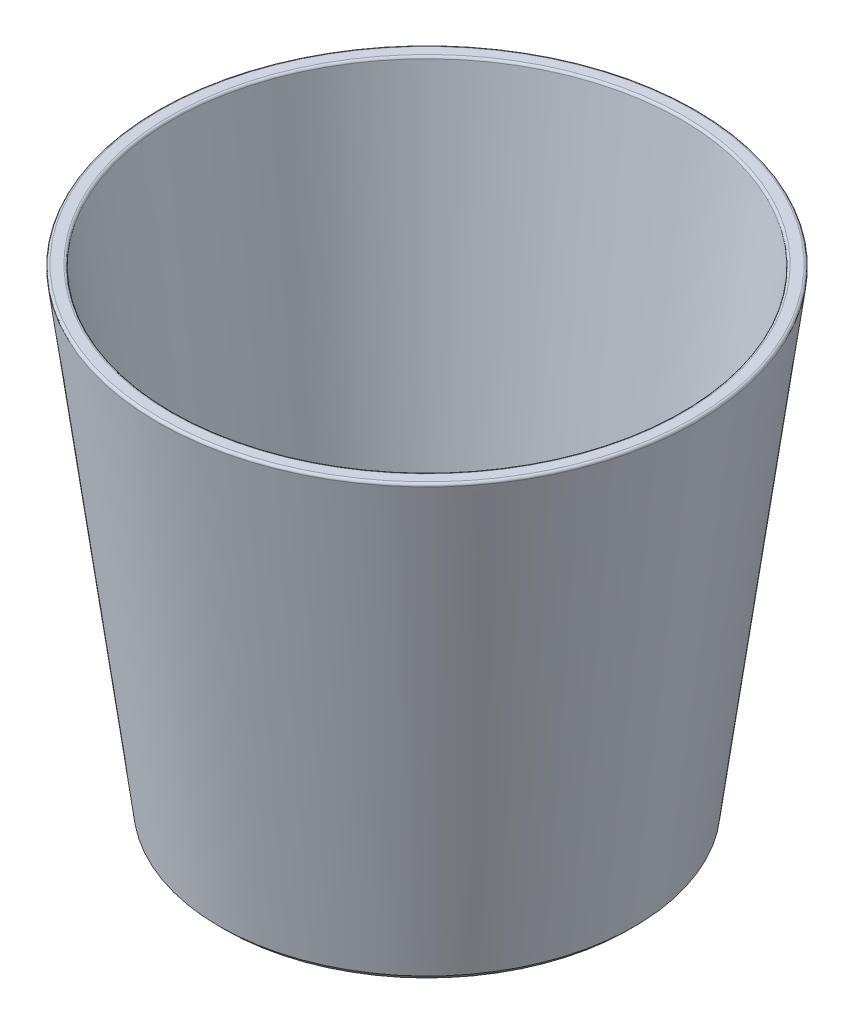
ISO-10303-21;
HEADER;
FILE_DESCRIPTION(('STEP AP214'),'2;1');
FILE_NAME('part.step','',(''),(''),'','','');
FILE_SCHEMA(('AUTOMOTIVE_DESIGN { 1 0 10303 214 1 1 1 1 }'));
ENDSEC;
DATA;
#1=APPLICATION_CONTEXT('core data for automotive mechanical design processes');
#2=APPLICATION_PROTOCOL_DEFINITION('international standard','automotive_design',2000,#1);
#3=PRODUCT_CONTEXT('',#1,'mechanical');
#4=PRODUCT('Part','Part','',(#3));
#5=PRODUCT_RELATED_PRODUCT_CATEGORY('part','',(#4));
#6=PRODUCT_DEFINITION_FORMATION('','',#4);
#7=PRODUCT_DEFINITION_CONTEXT('part definition',#1,'design');
#8=PRODUCT_DEFINITION('design','',#6,#7);
#9=PRODUCT_DEFINITION_SHAPE('','',#8);
#10=(LENGTH_UNIT() NAMED_UNIT(*) SI_UNIT(.MILLI.,.METRE.));
#11=(NAMED_UNIT(*) PLANE_ANGLE_UNIT() SI_UNIT($,.RADIAN.));
#12=(NAMED_UNIT(*) SI_UNIT($,.STERADIAN.) SOLID_ANGLE_UNIT());
#13=UNCERTAINTY_MEASURE_WITH_UNIT(LENGTH_MEASURE(1.E-05),#10,'distance_accuracy_value','');
#14=(GEOMETRIC_REPRESENTATION_CONTEXT(3) GLOBAL_UNCERTAINTY_ASSIGNED_CONTEXT((#13)) GLOBAL_UNIT_ASSIGNED_CONTEXT((#10,
#11,#12)) REPRESENTATION_CONTEXT('',''));
#15=CARTESIAN_POINT('',(0.,0.,0.));
#16=DIRECTION('',(0.,0.,1.));
#17=DIRECTION('',(1.,0.,0.));
#18=AXIS2_PLACEMENT_3D('',#15,#16,#17);
#19=CARTESIAN_POINT('',(0.,0.,-52.5));
#20=DIRECTION('',(0.,-1.,0.));
#21=DIRECTION('',(0.,0.,-1.));
#22=AXIS2_PLACEMENT_3D('',#19,#20,#21);
#23=PLANE('',#22);
#24=CARTESIAN_POINT('',(0.,0.,0.));
#25=DIRECTION('',(0.,-1.,0.));
#26=DIRECTION('',(0.,0.,-1.));
#27=AXIS2_PLACEMENT_3D('',#24,#25,#26);
#28=CIRCLE('',#27,54.9557589337812);
#29=CARTESIAN_POINT('',(0.,0.,-54.9557589337812));
#30=VERTEX_POINT('',#29);
#31=EDGE_CURVE('E52',#30,#30,#28,.F.);
#32=ORIENTED_EDGE('',*,*,#31,.T.);
#33=EDGE_LOOP('',(#32));
#34=FACE_BOUND('',#33,.T.);
#35=CARTESIAN_POINT('',(0.,0.,0.));
#36=DIRECTION('',(0.,-1.,0.));
#37=DIRECTION('',(0.,0.,-1.));
#38=AXIS2_PLACEMENT_3D('',#35,#36,#37);
#39=CIRCLE('',#38,52.9385202078089);
#40=CARTESIAN_POINT('',(0.,0.,-52.9385202078089));
#41=VERTEX_POINT('',#40);
#42=EDGE_CURVE('E57',#41,#41,#39,.T.);
#43=ORIENTED_EDGE('',*,*,#42,.T.);
#44=EDGE_LOOP('',(#43));
#45=FACE_BOUND('',#44,.T.);
#46=ADVANCED_FACE('F39',(#34,#45),#23,.F.);
#47=CARTESIAN_POINT('',(0.,-98.,0.));
#48=DIRECTION('',(0.,1.,0.));
#49=DIRECTION('',(0.,0.,1.));
#50=AXIS2_PLACEMENT_3D('',#47,#48,#49);
#51=CONICAL_SURFACE('',#50,42.6311212468532,0.130827396074057);
#52=CARTESIAN_POINT('',(0.,-0.565227256285661,0.));
#53=DIRECTION('',(0.,-1.,0.));
#54=DIRECTION('',(0.,0.,-1.));
#55=AXIS2_PLACEMENT_3D('',#52,#53,#54);
#56=CIRCLE('',#55,55.4514860815524);
#57=CARTESIAN_POINT('',(0.,-0.565227256285654,-55.4514860815524));
#58=VERTEX_POINT('',#57);
#59=EDGE_CURVE('E47',#58,#58,#56,.T.);
#60=ORIENTED_EDGE('',*,*,#59,.T.);
#61=EDGE_LOOP('',(#60));
#62=FACE_BOUND('',#61,.T.);
#63=CARTESIAN_POINT('',(0.,-96.8484848484848,0.));
#64=DIRECTION('',(0.,-1.,0.));
#65=DIRECTION('',(0.,0.,-1.));
#66=AXIS2_PLACEMENT_3D('',#63,#64,#65);
#67=CIRCLE('',#66,42.7826363983683);
#68=CARTESIAN_POINT('',(0.,-96.8484848484848,-42.7826363983683));
#69=VERTEX_POINT('',#68);
#70=EDGE_CURVE('E67',#69,#69,#67,.F.);
#71=ORIENTED_EDGE('',*,*,#70,.T.);
#72=EDGE_LOOP('',(#71));
#73=FACE_BOUND('',#72,.T.);
#74=ADVANCED_FACE('F92',(#62,#73),#51,.T.);
#75=CARTESIAN_POINT('',(0.,-98.,0.));
#76=DIRECTION('',(0.,1.,0.));
#77=DIRECTION('',(0.,0.,1.));
#78=AXIS2_PLACEMENT_3D('',#75,#76,#77);
#79=PLANE('',#78);
#80=CARTESIAN_POINT('',(0.,-98.,0.));
#81=DIRECTION('',(0.,1.,0.));
#82=DIRECTION('',(0.,0.,1.));
#83=AXIS2_PLACEMENT_3D('',#80,#81,#82);
#84=CIRCLE('',#83,41.6311212468532);
#85=CARTESIAN_POINT('',(0.,-98.,41.6311212468532));
#86=VERTEX_POINT('',#85);
#87=EDGE_CURVE('E63',#86,#86,#84,.F.);
#88=ORIENTED_EDGE('',*,*,#87,.T.);
#89=EDGE_LOOP('',(#88));
#90=FACE_BOUND('',#89,.T.);
#91=ADVANCED_FACE('F89',(#90),#79,.F.);
#92=CARTESIAN_POINT('',(0.,-95.,0.));
#93=DIRECTION('',(0.,-1.,0.));
#94=DIRECTION('',(0.,0.,-1.));
#95=AXIS2_PLACEMENT_3D('',#92,#93,#94);
#96=PLANE('',#95);
#97=CARTESIAN_POINT('',(0.,-95.,0.));
#98=DIRECTION('',(0.,1.,0.));
#99=DIRECTION('',(0.,0.,1.));
#100=AXIS2_PLACEMENT_3D('',#97,#98,#99);
#101=CIRCLE('',#100,40.);
#102=CARTESIAN_POINT('',(0.,-95.,40.));
#103=VERTEX_POINT('',#102);
#104=EDGE_CURVE('E71',#103,#103,#101,.T.);
#105=ORIENTED_EDGE('',*,*,#104,.T.);
#106=EDGE_LOOP('',(#105));
#107=FACE_BOUND('',#106,.T.);
#108=ADVANCED_FACE('F76',(#107),#96,.F.);
#109=CARTESIAN_POINT('',(0.,0.,0.));
#110=DIRECTION('',(0.,1.,0.));
#111=DIRECTION('',(0.,0.,1.));
#112=AXIS2_PLACEMENT_3D('',#109,#110,#111);
#113=CONICAL_SURFACE('',#112,52.5,0.130827396074057);
#114=CARTESIAN_POINT('',(0.,-0.43477274371434,0.));
#115=DIRECTION('',(0.,-1.,0.));
#116=DIRECTION('',(0.,0.,-1.));
#117=AXIS2_PLACEMENT_3D('',#114,#115,#116);
#118=CIRCLE('',#117,52.4427930600376);
#119=CARTESIAN_POINT('',(0.,-0.434772743714334,-52.4427930600376));
#120=VERTEX_POINT('',#119);
#121=EDGE_CURVE('E10',#120,#120,#118,.F.);
#122=ORIENTED_EDGE('',*,*,#121,.T.);
#123=EDGE_LOOP('',(#122));
#124=FACE_BOUND('',#123,.T.);
#125=ORIENTED_EDGE('',*,*,#104,.F.);
#126=EDGE_LOOP('',(#125));
#127=FACE_BOUND('',#126,.T.);
#128=ADVANCED_FACE('F78',(#124,#127),#113,.F.);
#129=CARTESIAN_POINT('',(0.,-96.8484848484848,0.));
#130=DIRECTION('',(0.,1.,0.));
#131=DIRECTION('',(0.,0.,1.));
#132=AXIS2_PLACEMENT_3D('',#129,#130,#131);
#133=CONICAL_SURFACE('',#132,42.7826363983683,0.785398163397451);
#134=ORIENTED_EDGE('',*,*,#87,.F.);
#135=EDGE_LOOP('',(#134));
#136=FACE_BOUND('',#135,.T.);
#137=ORIENTED_EDGE('',*,*,#70,.F.);
#138=EDGE_LOOP('',(#137));
#139=FACE_BOUND('',#138,.T.);
#140=ADVANCED_FACE('F80',(#136,#139),#133,.T.);
#141=CARTESIAN_POINT('',(0.,-0.5,0.));
#142=DIRECTION('',(0.,-1.,0.));
#143=DIRECTION('',(0.,0.,-1.));
#144=AXIS2_PLACEMENT_3D('',#141,#142,#143);
#145=TOROIDAL_SURFACE('',#144,54.9557589337812,0.5);
#146=ORIENTED_EDGE('',*,*,#59,.F.);
#147=EDGE_LOOP('',(#146));
#148=FACE_BOUND('',#147,.T.);
#149=ORIENTED_EDGE('',*,*,#31,.F.);
#150=EDGE_LOOP('',(#149));
#151=FACE_BOUND('',#150,.T.);
#152=ADVANCED_FACE('F86',(#148,#151),#145,.T.);
#153=CARTESIAN_POINT('',(0.,-0.500000000000007,0.));
#154=DIRECTION('',(0.,-1.,0.));
#155=DIRECTION('',(0.,0.,-1.));
#156=AXIS2_PLACEMENT_3D('',#153,#154,#155);
#157=TOROIDAL_SURFACE('',#156,52.9385202078089,0.5);
#158=ORIENTED_EDGE('',*,*,#42,.F.);
#159=EDGE_LOOP('',(#158));
#160=FACE_BOUND('',#159,.T.);
#161=ORIENTED_EDGE('',*,*,#121,.F.);
#162=EDGE_LOOP('',(#161));
#163=FACE_BOUND('',#162,.T.);
#164=ADVANCED_FACE('F41',(#160,#163),#157,.T.);
#165=CLOSED_SHELL('',(#46,#74,#91,#108,#128,#140,#152,#164));
#166=MANIFOLD_SOLID_BREP('B2',#165);
#167=ADVANCED_BREP_SHAPE_REPRESENTATION('',(#18,#166),#14);
#168=SHAPE_DEFINITION_REPRESENTATION(#9,#167);
ENDSEC;
END-ISO-10303-21;
